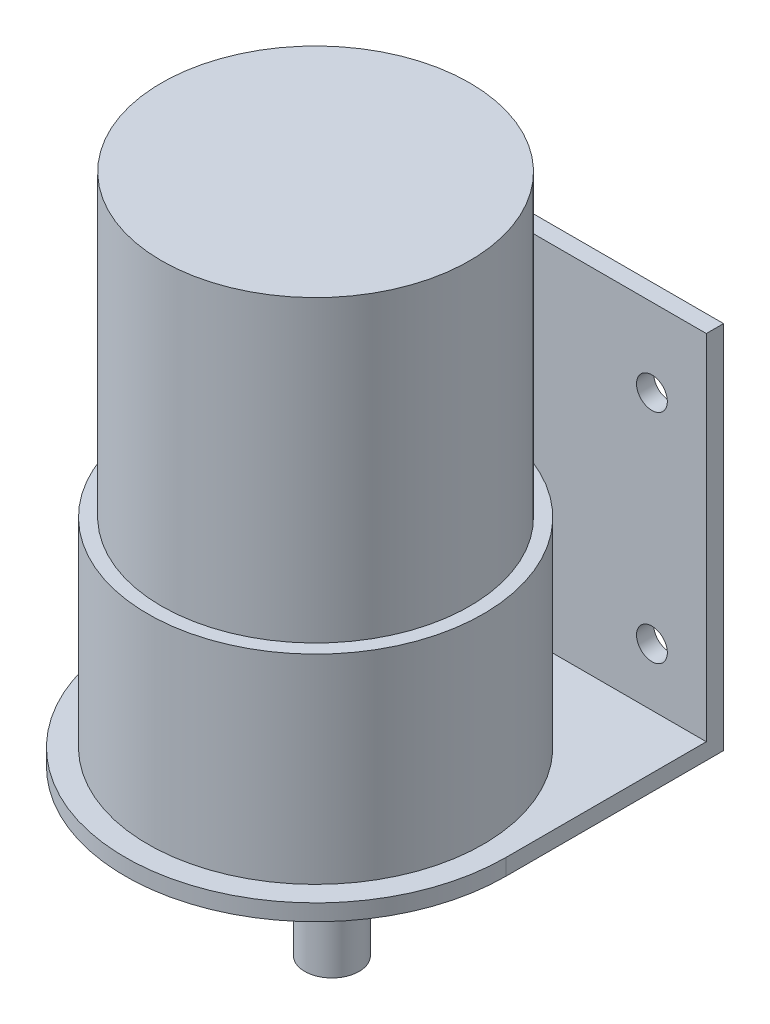
ISO-10303-21;
HEADER;
FILE_DESCRIPTION(('STEP AP214'),'2;1');
FILE_NAME('part.step','',(''),(''),'','','');
FILE_SCHEMA(('AUTOMOTIVE_DESIGN { 1 0 10303 214 1 1 1 1 }'));
ENDSEC;
DATA;
#1=APPLICATION_CONTEXT('core data for automotive mechanical design processes');
#2=APPLICATION_PROTOCOL_DEFINITION('international standard','automotive_design',2000,#1);
#3=PRODUCT_CONTEXT('',#1,'mechanical');
#4=PRODUCT('Part','Part','',(#3));
#5=PRODUCT_RELATED_PRODUCT_CATEGORY('part','',(#4));
#6=PRODUCT_DEFINITION_FORMATION('','',#4);
#7=PRODUCT_DEFINITION_CONTEXT('part definition',#1,'design');
#8=PRODUCT_DEFINITION('design','',#6,#7);
#9=PRODUCT_DEFINITION_SHAPE('','',#8);
#10=(LENGTH_UNIT() NAMED_UNIT(*) SI_UNIT(.MILLI.,.METRE.));
#11=(NAMED_UNIT(*) PLANE_ANGLE_UNIT() SI_UNIT($,.RADIAN.));
#12=(NAMED_UNIT(*) SI_UNIT($,.STERADIAN.) SOLID_ANGLE_UNIT());
#13=UNCERTAINTY_MEASURE_WITH_UNIT(LENGTH_MEASURE(1.E-05),#10,'distance_accuracy_value','');
#14=(GEOMETRIC_REPRESENTATION_CONTEXT(3) GLOBAL_UNCERTAINTY_ASSIGNED_CONTEXT((#13)) GLOBAL_UNIT_ASSIGNED_CONTEXT((#10,
#11,#12)) REPRESENTATION_CONTEXT('',''));
#15=CARTESIAN_POINT('',(0.,0.,0.));
#16=DIRECTION('',(0.,0.,1.));
#17=DIRECTION('',(1.,0.,0.));
#18=AXIS2_PLACEMENT_3D('',#15,#16,#17);
#19=CARTESIAN_POINT('',(0.,-22.,0.));
#20=DIRECTION('',(0.,-1.,0.));
#21=DIRECTION('',(0.,0.,-1.));
#22=AXIS2_PLACEMENT_3D('',#19,#20,#21);
#23=PLANE('',#22);
#24=CARTESIAN_POINT('',(0.,-22.,0.));
#25=DIRECTION('',(0.,-1.,0.));
#26=DIRECTION('',(0.,0.,-1.));
#27=AXIS2_PLACEMENT_3D('',#24,#25,#26);
#28=CIRCLE('',#27,18.5);
#29=CARTESIAN_POINT('',(0.,-22.,-18.5));
#30=VERTEX_POINT('',#29);
#31=EDGE_CURVE('E153',#30,#30,#28,.T.);
#32=ORIENTED_EDGE('',*,*,#31,.T.);
#33=EDGE_LOOP('',(#32));
#34=FACE_BOUND('',#33,.T.);
#35=DIRECTION('',(1.,0.,0.));
#36=VECTOR('',#35,1.);
#37=CARTESIAN_POINT('',(21.,-22.,-22.1));
#38=LINE('',#37,#36);
#39=CARTESIAN_POINT('',(-21.,-22.,-22.1));
#40=VERTEX_POINT('',#39);
#41=CARTESIAN_POINT('',(21.,-22.,-22.1));
#42=VERTEX_POINT('',#41);
#43=EDGE_CURVE('E126',#40,#42,#38,.T.);
#44=ORIENTED_EDGE('',*,*,#43,.F.);
#45=DIRECTION('',(0.,0.,-1.));
#46=VECTOR('',#45,1.);
#47=CARTESIAN_POINT('',(-21.,-22.,0.));
#48=LINE('',#47,#46);
#49=CARTESIAN_POINT('',(-21.,-22.,0.));
#50=VERTEX_POINT('',#49);
#51=EDGE_CURVE('E139',#50,#40,#48,.T.);
#52=ORIENTED_EDGE('',*,*,#51,.F.);
#53=CARTESIAN_POINT('',(0.,-22.,0.));
#54=DIRECTION('',(0.,-1.,0.));
#55=DIRECTION('',(0.,0.,-1.));
#56=AXIS2_PLACEMENT_3D('',#53,#54,#55);
#57=CIRCLE('',#56,21.);
#58=CARTESIAN_POINT('',(21.,-22.,0.));
#59=VERTEX_POINT('',#58);
#60=EDGE_CURVE('E80',#59,#50,#57,.T.);
#61=ORIENTED_EDGE('',*,*,#60,.F.);
#62=DIRECTION('',(0.,0.,1.));
#63=VECTOR('',#62,1.);
#64=CARTESIAN_POINT('',(21.,-22.,0.));
#65=LINE('',#64,#63);
#66=EDGE_CURVE('E137',#42,#59,#65,.T.);
#67=ORIENTED_EDGE('',*,*,#66,.F.);
#68=EDGE_LOOP('',(#44,#52,#61,#67));
#69=FACE_BOUND('',#68,.T.);
#70=ADVANCED_FACE('F39',(#34,#69),#23,.F.);
#71=CARTESIAN_POINT('',(0.,33.,0.));
#72=DIRECTION('',(0.,-1.,0.));
#73=DIRECTION('',(0.,0.,-1.));
#74=AXIS2_PLACEMENT_3D('',#71,#72,#73);
#75=CYLINDRICAL_SURFACE('',#74,17.);
#76=CARTESIAN_POINT('',(0.,33.,0.));
#77=DIRECTION('',(0.,1.,0.));
#78=DIRECTION('',(0.,0.,1.));
#79=AXIS2_PLACEMENT_3D('',#76,#77,#78);
#80=CIRCLE('',#79,17.);
#81=CARTESIAN_POINT('',(0.,33.,17.));
#82=VERTEX_POINT('',#81);
#83=EDGE_CURVE('E157',#82,#82,#80,.T.);
#84=ORIENTED_EDGE('',*,*,#83,.F.);
#85=EDGE_LOOP('',(#84));
#86=FACE_BOUND('',#85,.T.);
#87=CARTESIAN_POINT('',(0.,0.,0.));
#88=DIRECTION('',(0.,1.,0.));
#89=DIRECTION('',(0.,0.,1.));
#90=AXIS2_PLACEMENT_3D('',#87,#88,#89);
#91=CIRCLE('',#90,17.);
#92=CARTESIAN_POINT('',(0.,0.,17.));
#93=VERTEX_POINT('',#92);
#94=EDGE_CURVE('E43',#93,#93,#91,.T.);
#95=ORIENTED_EDGE('',*,*,#94,.T.);
#96=EDGE_LOOP('',(#95));
#97=FACE_BOUND('',#96,.T.);
#98=ADVANCED_FACE('F41',(#86,#97),#75,.T.);
#99=CARTESIAN_POINT('',(0.,33.,0.));
#100=DIRECTION('',(0.,1.,0.));
#101=DIRECTION('',(0.,0.,1.));
#102=AXIS2_PLACEMENT_3D('',#99,#100,#101);
#103=PLANE('',#102);
#104=ORIENTED_EDGE('',*,*,#83,.T.);
#105=EDGE_LOOP('',(#104));
#106=FACE_BOUND('',#105,.T.);
#107=ADVANCED_FACE('F174',(#106),#103,.T.);
#108=CARTESIAN_POINT('',(0.,-22.,0.));
#109=DIRECTION('',(0.,1.,0.));
#110=DIRECTION('',(0.,0.,1.));
#111=AXIS2_PLACEMENT_3D('',#108,#109,#110);
#112=CYLINDRICAL_SURFACE('',#111,18.5);
#113=ORIENTED_EDGE('',*,*,#31,.F.);
#114=EDGE_LOOP('',(#113));
#115=FACE_BOUND('',#114,.T.);
#116=CARTESIAN_POINT('',(0.,0.,0.));
#117=DIRECTION('',(0.,-1.,0.));
#118=DIRECTION('',(0.,0.,-1.));
#119=AXIS2_PLACEMENT_3D('',#116,#117,#118);
#120=CIRCLE('',#119,18.5);
#121=CARTESIAN_POINT('',(0.,0.,-18.5));
#122=VERTEX_POINT('',#121);
#123=EDGE_CURVE('E152',#122,#122,#120,.T.);
#124=ORIENTED_EDGE('',*,*,#123,.T.);
#125=EDGE_LOOP('',(#124));
#126=FACE_BOUND('',#125,.T.);
#127=ADVANCED_FACE('F169',(#115,#126),#112,.T.);
#128=CARTESIAN_POINT('',(0.,0.,0.));
#129=DIRECTION('',(0.,-1.,0.));
#130=DIRECTION('',(0.,0.,-1.));
#131=AXIS2_PLACEMENT_3D('',#128,#129,#130);
#132=PLANE('',#131);
#133=ORIENTED_EDGE('',*,*,#94,.F.);
#134=EDGE_LOOP('',(#133));
#135=FACE_BOUND('',#134,.T.);
#136=ORIENTED_EDGE('',*,*,#123,.F.);
#137=EDGE_LOOP('',(#136));
#138=FACE_BOUND('',#137,.T.);
#139=ADVANCED_FACE('F166',(#135,#138),#132,.F.);
#140=CARTESIAN_POINT('',(21.,-23.8,-24.));
#141=DIRECTION('',(0.,0.,1.));
#142=DIRECTION('',(1.,0.,0.));
#143=AXIS2_PLACEMENT_3D('',#140,#141,#142);
#144=PLANE('',#143);
#145=CARTESIAN_POINT('',(15.,-15.65,-24.));
#146=DIRECTION('',(0.,0.,-1.));
#147=DIRECTION('',(-1.,0.,0.));
#148=AXIS2_PLACEMENT_3D('',#145,#146,#147);
#149=CIRCLE('',#148,1.7);
#150=CARTESIAN_POINT('',(13.3,-15.65,-24.));
#151=VERTEX_POINT('',#150);
#152=EDGE_CURVE('E208',#151,#151,#149,.T.);
#153=ORIENTED_EDGE('',*,*,#152,.F.);
#154=EDGE_LOOP('',(#153));
#155=FACE_BOUND('',#154,.T.);
#156=CARTESIAN_POINT('',(-15.,8.35,-24.));
#157=DIRECTION('',(0.,0.,-1.));
#158=DIRECTION('',(-1.,0.,0.));
#159=AXIS2_PLACEMENT_3D('',#156,#157,#158);
#160=CIRCLE('',#159,1.7);
#161=CARTESIAN_POINT('',(-16.7,8.35,-24.));
#162=VERTEX_POINT('',#161);
#163=EDGE_CURVE('E212',#162,#162,#160,.T.);
#164=ORIENTED_EDGE('',*,*,#163,.F.);
#165=EDGE_LOOP('',(#164));
#166=FACE_BOUND('',#165,.T.);
#167=CARTESIAN_POINT('',(-15.,-15.65,-24.));
#168=DIRECTION('',(0.,0.,-1.));
#169=DIRECTION('',(-1.,0.,0.));
#170=AXIS2_PLACEMENT_3D('',#167,#168,#169);
#171=CIRCLE('',#170,1.7);
#172=CARTESIAN_POINT('',(-16.7,-15.65,-24.));
#173=VERTEX_POINT('',#172);
#174=EDGE_CURVE('E216',#173,#173,#171,.T.);
#175=ORIENTED_EDGE('',*,*,#174,.F.);
#176=EDGE_LOOP('',(#175));
#177=FACE_BOUND('',#176,.T.);
#178=CARTESIAN_POINT('',(15.,8.35,-24.));
#179=DIRECTION('',(0.,0.,-1.));
#180=DIRECTION('',(-1.,0.,0.));
#181=AXIS2_PLACEMENT_3D('',#178,#179,#180);
#182=CIRCLE('',#181,1.7);
#183=CARTESIAN_POINT('',(13.3,8.35,-24.));
#184=VERTEX_POINT('',#183);
#185=EDGE_CURVE('E219',#184,#184,#182,.T.);
#186=ORIENTED_EDGE('',*,*,#185,.F.);
#187=EDGE_LOOP('',(#186));
#188=FACE_BOUND('',#187,.T.);
#189=DIRECTION('',(0.,1.,0.));
#190=VECTOR('',#189,1.);
#191=CARTESIAN_POINT('',(-21.,-23.8,-24.));
#192=LINE('',#191,#190);
#193=CARTESIAN_POINT('',(-21.,-23.8,-24.));
#194=VERTEX_POINT('',#193);
#195=CARTESIAN_POINT('',(-21.,17.,-24.));
#196=VERTEX_POINT('',#195);
#197=EDGE_CURVE('E104',#194,#196,#192,.T.);
#198=ORIENTED_EDGE('',*,*,#197,.T.);
#199=DIRECTION('',(-1.,0.,0.));
#200=VECTOR('',#199,1.);
#201=CARTESIAN_POINT('',(-21.,17.,-24.));
#202=LINE('',#201,#200);
#203=CARTESIAN_POINT('',(21.,17.,-24.));
#204=VERTEX_POINT('',#203);
#205=EDGE_CURVE('E109',#204,#196,#202,.T.);
#206=ORIENTED_EDGE('',*,*,#205,.F.);
#207=DIRECTION('',(0.,1.,0.));
#208=VECTOR('',#207,1.);
#209=CARTESIAN_POINT('',(21.,-23.8,-24.));
#210=LINE('',#209,#208);
#211=CARTESIAN_POINT('',(21.,-23.8,-24.));
#212=VERTEX_POINT('',#211);
#213=EDGE_CURVE('E150',#212,#204,#210,.T.);
#214=ORIENTED_EDGE('',*,*,#213,.F.);
#215=DIRECTION('',(1.,0.,0.));
#216=VECTOR('',#215,1.);
#217=CARTESIAN_POINT('',(21.,-23.8,-24.));
#218=LINE('',#217,#216);
#219=EDGE_CURVE('E110',#194,#212,#218,.T.);
#220=ORIENTED_EDGE('',*,*,#219,.F.);
#221=EDGE_LOOP('',(#198,#206,#214,#220));
#222=FACE_BOUND('',#221,.T.);
#223=ADVANCED_FACE('F106',(#155,#166,#177,#188,#222),#144,.F.);
#224=CARTESIAN_POINT('',(21.,-23.8,0.));
#225=DIRECTION('',(-1.,0.,0.));
#226=DIRECTION('',(0.,0.,1.));
#227=AXIS2_PLACEMENT_3D('',#224,#225,#226);
#228=PLANE('',#227);
#229=ORIENTED_EDGE('',*,*,#213,.T.);
#230=DIRECTION('',(0.,0.,-1.));
#231=VECTOR('',#230,1.);
#232=CARTESIAN_POINT('',(21.,17.,-24.));
#233=LINE('',#232,#231);
#234=CARTESIAN_POINT('',(21.,17.,-22.1));
#235=VERTEX_POINT('',#234);
#236=EDGE_CURVE('E125',#235,#204,#233,.T.);
#237=ORIENTED_EDGE('',*,*,#236,.F.);
#238=DIRECTION('',(0.,-1.,0.));
#239=VECTOR('',#238,1.);
#240=CARTESIAN_POINT('',(21.,17.,-22.1));
#241=LINE('',#240,#239);
#242=EDGE_CURVE('E56',#235,#42,#241,.T.);
#243=ORIENTED_EDGE('',*,*,#242,.T.);
#244=ORIENTED_EDGE('',*,*,#66,.T.);
#245=DIRECTION('',(0.,1.,0.));
#246=VECTOR('',#245,1.);
#247=CARTESIAN_POINT('',(21.,-23.8,0.));
#248=LINE('',#247,#246);
#249=CARTESIAN_POINT('',(21.,-23.8,0.));
#250=VERTEX_POINT('',#249);
#251=EDGE_CURVE('E148',#250,#59,#248,.T.);
#252=ORIENTED_EDGE('',*,*,#251,.F.);
#253=DIRECTION('',(0.,0.,1.));
#254=VECTOR('',#253,1.);
#255=CARTESIAN_POINT('',(21.,-23.8,0.));
#256=LINE('',#255,#254);
#257=EDGE_CURVE('E87',#212,#250,#256,.T.);
#258=ORIENTED_EDGE('',*,*,#257,.F.);
#259=EDGE_LOOP('',(#229,#237,#243,#244,#252,#258));
#260=FACE_BOUND('',#259,.T.);
#261=ADVANCED_FACE('F198',(#260),#228,.F.);
#262=CARTESIAN_POINT('',(0.,-23.8,0.));
#263=DIRECTION('',(0.,1.,0.));
#264=DIRECTION('',(0.,0.,1.));
#265=AXIS2_PLACEMENT_3D('',#262,#263,#264);
#266=CYLINDRICAL_SURFACE('',#265,21.);
#267=ORIENTED_EDGE('',*,*,#60,.T.);
#268=DIRECTION('',(0.,1.,0.));
#269=VECTOR('',#268,1.);
#270=CARTESIAN_POINT('',(-21.,-23.8,0.));
#271=LINE('',#270,#269);
#272=CARTESIAN_POINT('',(-21.,-23.8,0.));
#273=VERTEX_POINT('',#272);
#274=EDGE_CURVE('E112',#273,#50,#271,.T.);
#275=ORIENTED_EDGE('',*,*,#274,.F.);
#276=CARTESIAN_POINT('',(0.,-23.8,0.));
#277=DIRECTION('',(0.,-1.,0.));
#278=DIRECTION('',(0.,0.,-1.));
#279=AXIS2_PLACEMENT_3D('',#276,#277,#278);
#280=CIRCLE('',#279,21.);
#281=EDGE_CURVE('E141',#250,#273,#280,.T.);
#282=ORIENTED_EDGE('',*,*,#281,.F.);
#283=ORIENTED_EDGE('',*,*,#251,.T.);
#284=EDGE_LOOP('',(#267,#275,#282,#283));
#285=FACE_BOUND('',#284,.T.);
#286=ADVANCED_FACE('F195',(#285),#266,.T.);
#287=CARTESIAN_POINT('',(-21.,-23.8,0.));
#288=DIRECTION('',(1.,0.,0.));
#289=DIRECTION('',(0.,0.,-1.));
#290=AXIS2_PLACEMENT_3D('',#287,#288,#289);
#291=PLANE('',#290);
#292=ORIENTED_EDGE('',*,*,#51,.T.);
#293=DIRECTION('',(0.,-1.,0.));
#294=VECTOR('',#293,1.);
#295=CARTESIAN_POINT('',(-21.,17.,-22.1));
#296=LINE('',#295,#294);
#297=CARTESIAN_POINT('',(-21.,17.,-22.1));
#298=VERTEX_POINT('',#297);
#299=EDGE_CURVE('E118',#298,#40,#296,.T.);
#300=ORIENTED_EDGE('',*,*,#299,.F.);
#301=DIRECTION('',(0.,0.,1.));
#302=VECTOR('',#301,1.);
#303=CARTESIAN_POINT('',(-21.,17.,-24.));
#304=LINE('',#303,#302);
#305=EDGE_CURVE('E115',#196,#298,#304,.T.);
#306=ORIENTED_EDGE('',*,*,#305,.F.);
#307=ORIENTED_EDGE('',*,*,#197,.F.);
#308=DIRECTION('',(0.,0.,-1.));
#309=VECTOR('',#308,1.);
#310=CARTESIAN_POINT('',(-21.,-23.8,0.));
#311=LINE('',#310,#309);
#312=EDGE_CURVE('E65',#273,#194,#311,.T.);
#313=ORIENTED_EDGE('',*,*,#312,.F.);
#314=ORIENTED_EDGE('',*,*,#274,.T.);
#315=EDGE_LOOP('',(#292,#300,#306,#307,#313,#314));
#316=FACE_BOUND('',#315,.T.);
#317=ADVANCED_FACE('F117',(#316),#291,.F.);
#318=CARTESIAN_POINT('',(0.,-23.8,0.));
#319=DIRECTION('',(0.,-1.,0.));
#320=DIRECTION('',(0.,0.,-1.));
#321=AXIS2_PLACEMENT_3D('',#318,#319,#320);
#322=PLANE('',#321);
#323=CARTESIAN_POINT('',(0.,-23.8,-1.8));
#324=DIRECTION('',(0.,-1.,0.));
#325=DIRECTION('',(0.,0.,-1.));
#326=AXIS2_PLACEMENT_3D('',#323,#324,#325);
#327=CIRCLE('',#326,6.);
#328=CARTESIAN_POINT('',(0.,-23.8,-7.8));
#329=VERTEX_POINT('',#328);
#330=EDGE_CURVE('E48',#329,#329,#327,.T.);
#331=ORIENTED_EDGE('',*,*,#330,.F.);
#332=EDGE_LOOP('',(#331));
#333=FACE_BOUND('',#332,.T.);
#334=ORIENTED_EDGE('',*,*,#219,.T.);
#335=ORIENTED_EDGE('',*,*,#257,.T.);
#336=ORIENTED_EDGE('',*,*,#281,.T.);
#337=ORIENTED_EDGE('',*,*,#312,.T.);
#338=EDGE_LOOP('',(#334,#335,#336,#337));
#339=FACE_BOUND('',#338,.T.);
#340=ADVANCED_FACE('F191',(#333,#339),#322,.T.);
#341=CARTESIAN_POINT('',(21.,17.,-22.1));
#342=DIRECTION('',(0.,0.,-1.));
#343=DIRECTION('',(-1.,0.,0.));
#344=AXIS2_PLACEMENT_3D('',#341,#342,#343);
#345=PLANE('',#344);
#346=CARTESIAN_POINT('',(15.,-15.65,-22.1));
#347=DIRECTION('',(0.,0.,-1.));
#348=DIRECTION('',(-1.,0.,0.));
#349=AXIS2_PLACEMENT_3D('',#346,#347,#348);
#350=CIRCLE('',#349,1.7);
#351=CARTESIAN_POINT('',(13.3,-15.65,-22.1));
#352=VERTEX_POINT('',#351);
#353=EDGE_CURVE('E292',#352,#352,#350,.F.);
#354=ORIENTED_EDGE('',*,*,#353,.F.);
#355=EDGE_LOOP('',(#354));
#356=FACE_BOUND('',#355,.T.);
#357=CARTESIAN_POINT('',(-15.,8.35,-22.1));
#358=DIRECTION('',(0.,0.,-1.));
#359=DIRECTION('',(-1.,0.,0.));
#360=AXIS2_PLACEMENT_3D('',#357,#358,#359);
#361=CIRCLE('',#360,1.7);
#362=CARTESIAN_POINT('',(-16.7,8.35,-22.1));
#363=VERTEX_POINT('',#362);
#364=EDGE_CURVE('E289',#363,#363,#361,.F.);
#365=ORIENTED_EDGE('',*,*,#364,.F.);
#366=EDGE_LOOP('',(#365));
#367=FACE_BOUND('',#366,.T.);
#368=CARTESIAN_POINT('',(-15.,-15.65,-22.1));
#369=DIRECTION('',(0.,0.,-1.));
#370=DIRECTION('',(-1.,0.,0.));
#371=AXIS2_PLACEMENT_3D('',#368,#369,#370);
#372=CIRCLE('',#371,1.7);
#373=CARTESIAN_POINT('',(-16.7,-15.65,-22.1));
#374=VERTEX_POINT('',#373);
#375=EDGE_CURVE('E286',#374,#374,#372,.F.);
#376=ORIENTED_EDGE('',*,*,#375,.F.);
#377=EDGE_LOOP('',(#376));
#378=FACE_BOUND('',#377,.T.);
#379=CARTESIAN_POINT('',(15.,8.35,-22.1));
#380=DIRECTION('',(0.,0.,-1.));
#381=DIRECTION('',(-1.,0.,0.));
#382=AXIS2_PLACEMENT_3D('',#379,#380,#381);
#383=CIRCLE('',#382,1.7);
#384=CARTESIAN_POINT('',(13.3,8.35,-22.1));
#385=VERTEX_POINT('',#384);
#386=EDGE_CURVE('E222',#385,#385,#383,.F.);
#387=ORIENTED_EDGE('',*,*,#386,.F.);
#388=EDGE_LOOP('',(#387));
#389=FACE_BOUND('',#388,.T.);
#390=ORIENTED_EDGE('',*,*,#43,.T.);
#391=ORIENTED_EDGE('',*,*,#242,.F.);
#392=DIRECTION('',(1.,0.,0.));
#393=VECTOR('',#392,1.);
#394=CARTESIAN_POINT('',(21.,17.,-22.1));
#395=LINE('',#394,#393);
#396=EDGE_CURVE('E121',#298,#235,#395,.T.);
#397=ORIENTED_EDGE('',*,*,#396,.F.);
#398=ORIENTED_EDGE('',*,*,#299,.T.);
#399=EDGE_LOOP('',(#390,#391,#397,#398));
#400=FACE_BOUND('',#399,.T.);
#401=ADVANCED_FACE('F241',(#356,#367,#378,#389,#400),#345,.F.);
#402=CARTESIAN_POINT('',(0.,17.,0.));
#403=DIRECTION('',(0.,-1.,0.));
#404=DIRECTION('',(0.,0.,-1.));
#405=AXIS2_PLACEMENT_3D('',#402,#403,#404);
#406=PLANE('',#405);
#407=ORIENTED_EDGE('',*,*,#205,.T.);
#408=ORIENTED_EDGE('',*,*,#305,.T.);
#409=ORIENTED_EDGE('',*,*,#396,.T.);
#410=ORIENTED_EDGE('',*,*,#236,.T.);
#411=EDGE_LOOP('',(#407,#408,#409,#410));
#412=FACE_BOUND('',#411,.T.);
#413=ADVANCED_FACE('F124',(#412),#406,.F.);
#414=CARTESIAN_POINT('',(0.,-27.8,-1.8));
#415=DIRECTION('',(0.,1.,0.));
#416=DIRECTION('',(0.,0.,1.));
#417=AXIS2_PLACEMENT_3D('',#414,#415,#416);
#418=CYLINDRICAL_SURFACE('',#417,6.);
#419=CARTESIAN_POINT('',(0.,-27.8,-1.8));
#420=DIRECTION('',(0.,-1.,0.));
#421=DIRECTION('',(0.,0.,-1.));
#422=AXIS2_PLACEMENT_3D('',#419,#420,#421);
#423=CIRCLE('',#422,6.);
#424=CARTESIAN_POINT('',(0.,-27.8,-7.8));
#425=VERTEX_POINT('',#424);
#426=EDGE_CURVE('E128',#425,#425,#423,.T.);
#427=ORIENTED_EDGE('',*,*,#426,.F.);
#428=EDGE_LOOP('',(#427));
#429=FACE_BOUND('',#428,.T.);
#430=ORIENTED_EDGE('',*,*,#330,.T.);
#431=EDGE_LOOP('',(#430));
#432=FACE_BOUND('',#431,.T.);
#433=ADVANCED_FACE('F234',(#429,#432),#418,.T.);
#434=CARTESIAN_POINT('',(0.,-27.8,-1.8));
#435=DIRECTION('',(0.,-1.,0.));
#436=DIRECTION('',(0.,0.,-1.));
#437=AXIS2_PLACEMENT_3D('',#434,#435,#436);
#438=PLANE('',#437);
#439=CARTESIAN_POINT('',(0.,-27.8,-1.8));
#440=DIRECTION('',(0.,-1.,0.));
#441=DIRECTION('',(0.,0.,-1.));
#442=AXIS2_PLACEMENT_3D('',#439,#440,#441);
#443=CIRCLE('',#442,3.);
#444=CARTESIAN_POINT('',(0.,-27.8,-4.8));
#445=VERTEX_POINT('',#444);
#446=EDGE_CURVE('E11',#445,#445,#443,.T.);
#447=ORIENTED_EDGE('',*,*,#446,.F.);
#448=EDGE_LOOP('',(#447));
#449=FACE_BOUND('',#448,.T.);
#450=ORIENTED_EDGE('',*,*,#426,.T.);
#451=EDGE_LOOP('',(#450));
#452=FACE_BOUND('',#451,.T.);
#453=ADVANCED_FACE('F232',(#449,#452),#438,.T.);
#454=CARTESIAN_POINT('',(0.,-42.8,-1.8));
#455=DIRECTION('',(0.,1.,0.));
#456=DIRECTION('',(0.,0.,1.));
#457=AXIS2_PLACEMENT_3D('',#454,#455,#456);
#458=CYLINDRICAL_SURFACE('',#457,3.);
#459=CARTESIAN_POINT('',(0.,-42.8,-1.8));
#460=DIRECTION('',(0.,-1.,0.));
#461=DIRECTION('',(0.,0.,-1.));
#462=AXIS2_PLACEMENT_3D('',#459,#460,#461);
#463=CIRCLE('',#462,3.);
#464=CARTESIAN_POINT('',(0.,-42.8,-4.8));
#465=VERTEX_POINT('',#464);
#466=EDGE_CURVE('E221',#465,#465,#463,.T.);
#467=ORIENTED_EDGE('',*,*,#466,.F.);
#468=EDGE_LOOP('',(#467));
#469=FACE_BOUND('',#468,.T.);
#470=ORIENTED_EDGE('',*,*,#446,.T.);
#471=EDGE_LOOP('',(#470));
#472=FACE_BOUND('',#471,.T.);
#473=ADVANCED_FACE('F258',(#469,#472),#458,.T.);
#474=CARTESIAN_POINT('',(0.,-42.8,-1.8));
#475=DIRECTION('',(0.,-1.,0.));
#476=DIRECTION('',(0.,0.,-1.));
#477=AXIS2_PLACEMENT_3D('',#474,#475,#476);
#478=PLANE('',#477);
#479=ORIENTED_EDGE('',*,*,#466,.T.);
#480=EDGE_LOOP('',(#479));
#481=FACE_BOUND('',#480,.T.);
#482=ADVANCED_FACE('F262',(#481),#478,.T.);
#483=CARTESIAN_POINT('',(15.,8.35,21.001));
#484=DIRECTION('',(0.,0.,-1.));
#485=DIRECTION('',(-1.,0.,0.));
#486=AXIS2_PLACEMENT_3D('',#483,#484,#485);
#487=CYLINDRICAL_SURFACE('',#486,1.7);
#488=ORIENTED_EDGE('',*,*,#185,.T.);
#489=EDGE_LOOP('',(#488));
#490=FACE_BOUND('',#489,.T.);
#491=ORIENTED_EDGE('',*,*,#386,.T.);
#492=EDGE_LOOP('',(#491));
#493=FACE_BOUND('',#492,.T.);
#494=ADVANCED_FACE('F266',(#490,#493),#487,.F.);
#495=CARTESIAN_POINT('',(-15.,-15.65,21.001));
#496=DIRECTION('',(0.,0.,-1.));
#497=DIRECTION('',(-1.,0.,0.));
#498=AXIS2_PLACEMENT_3D('',#495,#496,#497);
#499=CYLINDRICAL_SURFACE('',#498,1.7);
#500=ORIENTED_EDGE('',*,*,#174,.T.);
#501=EDGE_LOOP('',(#500));
#502=FACE_BOUND('',#501,.T.);
#503=ORIENTED_EDGE('',*,*,#375,.T.);
#504=EDGE_LOOP('',(#503));
#505=FACE_BOUND('',#504,.T.);
#506=ADVANCED_FACE('F270',(#502,#505),#499,.F.);
#507=CARTESIAN_POINT('',(-15.,8.35,21.001));
#508=DIRECTION('',(0.,0.,-1.));
#509=DIRECTION('',(-1.,0.,0.));
#510=AXIS2_PLACEMENT_3D('',#507,#508,#509);
#511=CYLINDRICAL_SURFACE('',#510,1.7);
#512=ORIENTED_EDGE('',*,*,#163,.T.);
#513=EDGE_LOOP('',(#512));
#514=FACE_BOUND('',#513,.T.);
#515=ORIENTED_EDGE('',*,*,#364,.T.);
#516=EDGE_LOOP('',(#515));
#517=FACE_BOUND('',#516,.T.);
#518=ADVANCED_FACE('F271',(#514,#517),#511,.F.);
#519=CARTESIAN_POINT('',(15.,-15.65,21.001));
#520=DIRECTION('',(0.,0.,-1.));
#521=DIRECTION('',(-1.,0.,0.));
#522=AXIS2_PLACEMENT_3D('',#519,#520,#521);
#523=CYLINDRICAL_SURFACE('',#522,1.7);
#524=ORIENTED_EDGE('',*,*,#152,.T.);
#525=EDGE_LOOP('',(#524));
#526=FACE_BOUND('',#525,.T.);
#527=ORIENTED_EDGE('',*,*,#353,.T.);
#528=EDGE_LOOP('',(#527));
#529=FACE_BOUND('',#528,.T.);
#530=ADVANCED_FACE('F274',(#526,#529),#523,.F.);
#531=CLOSED_SHELL('',(#70,#98,#107,#127,#139,#223,#261,#286,#317,#340,#401,#413,#433,#453,#473,
#482,#494,#506,#518,#530));
#532=MANIFOLD_SOLID_BREP('B2',#531);
#533=ADVANCED_BREP_SHAPE_REPRESENTATION('',(#18,#532),#14);
#534=SHAPE_DEFINITION_REPRESENTATION(#9,#533);
ENDSEC;
END-ISO-10303-21;
